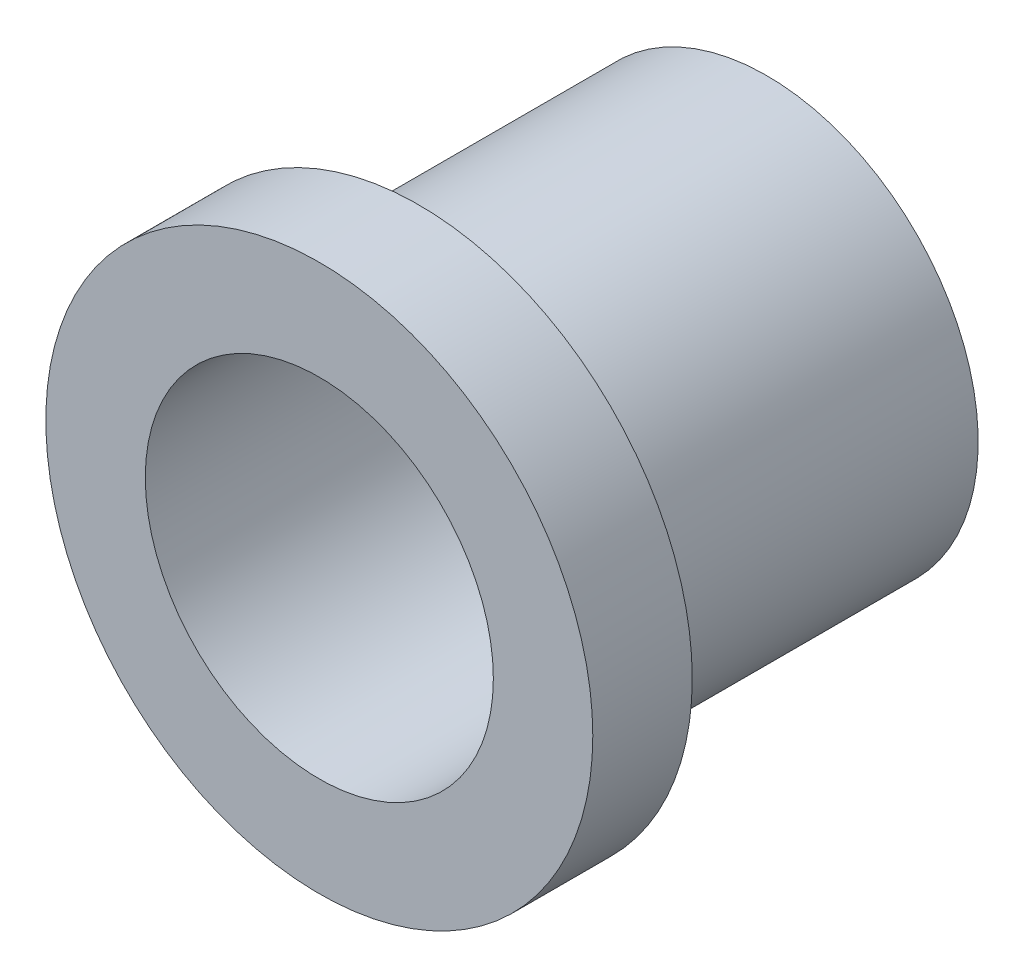
ISO-10303-21;
HEADER;
FILE_DESCRIPTION(('STEP AP214'),'2;1');
FILE_NAME('part.step','',(''),(''),'','','');
FILE_SCHEMA(('AUTOMOTIVE_DESIGN { 1 0 10303 214 1 1 1 1 }'));
ENDSEC;
DATA;
#1=APPLICATION_CONTEXT('core data for automotive mechanical design processes');
#2=APPLICATION_PROTOCOL_DEFINITION('international standard','automotive_design',2000,#1);
#3=PRODUCT_CONTEXT('',#1,'mechanical');
#4=PRODUCT('Part','Part','',(#3));
#5=PRODUCT_RELATED_PRODUCT_CATEGORY('part','',(#4));
#6=PRODUCT_DEFINITION_FORMATION('','',#4);
#7=PRODUCT_DEFINITION_CONTEXT('part definition',#1,'design');
#8=PRODUCT_DEFINITION('design','',#6,#7);
#9=PRODUCT_DEFINITION_SHAPE('','',#8);
#10=(LENGTH_UNIT() NAMED_UNIT(*) SI_UNIT(.MILLI.,.METRE.));
#11=(NAMED_UNIT(*) PLANE_ANGLE_UNIT() SI_UNIT($,.RADIAN.));
#12=(NAMED_UNIT(*) SI_UNIT($,.STERADIAN.) SOLID_ANGLE_UNIT());
#13=UNCERTAINTY_MEASURE_WITH_UNIT(LENGTH_MEASURE(1.E-05),#10,'distance_accuracy_value','');
#14=(GEOMETRIC_REPRESENTATION_CONTEXT(3) GLOBAL_UNCERTAINTY_ASSIGNED_CONTEXT((#13)) GLOBAL_UNIT_ASSIGNED_CONTEXT((#10,
#11,#12)) REPRESENTATION_CONTEXT('',''));
#15=CARTESIAN_POINT('',(0.,0.,0.));
#16=DIRECTION('',(0.,0.,1.));
#17=DIRECTION('',(1.,0.,0.));
#18=AXIS2_PLACEMENT_3D('',#15,#16,#17);
#19=CARTESIAN_POINT('',(0.,0.,-2.));
#20=DIRECTION('',(0.,0.,1.));
#21=DIRECTION('',(1.,0.,0.));
#22=AXIS2_PLACEMENT_3D('',#19,#20,#21);
#23=CYLINDRICAL_SURFACE('',#22,5.50000000000001);
#24=CARTESIAN_POINT('',(0.,0.,-2.));
#25=DIRECTION('',(0.,0.,1.));
#26=DIRECTION('',(1.,0.,0.));
#27=AXIS2_PLACEMENT_3D('',#24,#25,#26);
#28=CIRCLE('',#27,5.50000000000001);
#29=CARTESIAN_POINT('',(5.50000000000001,0.,-2.));
#30=VERTEX_POINT('',#29);
#31=EDGE_CURVE('E44',#30,#30,#28,.T.);
#32=ORIENTED_EDGE('',*,*,#31,.T.);
#33=EDGE_LOOP('',(#32));
#34=FACE_BOUND('',#33,.T.);
#35=CARTESIAN_POINT('',(0.,0.,0.));
#36=DIRECTION('',(0.,0.,1.));
#37=DIRECTION('',(1.,0.,0.));
#38=AXIS2_PLACEMENT_3D('',#35,#36,#37);
#39=CIRCLE('',#38,5.50000000000001);
#40=CARTESIAN_POINT('',(5.50000000000001,0.,0.));
#41=VERTEX_POINT('',#40);
#42=EDGE_CURVE('E40',#41,#41,#39,.T.);
#43=ORIENTED_EDGE('',*,*,#42,.F.);
#44=EDGE_LOOP('',(#43));
#45=FACE_BOUND('',#44,.T.);
#46=ADVANCED_FACE('F37',(#34,#45),#23,.T.);
#47=CARTESIAN_POINT('',(0.,0.,-2.));
#48=DIRECTION('',(0.,0.,1.));
#49=DIRECTION('',(1.,0.,0.));
#50=AXIS2_PLACEMENT_3D('',#47,#48,#49);
#51=PLANE('',#50);
#52=CARTESIAN_POINT('',(0.,0.,-2.));
#53=DIRECTION('',(0.,0.,-1.));
#54=DIRECTION('',(-1.,0.,0.));
#55=AXIS2_PLACEMENT_3D('',#52,#53,#54);
#56=CIRCLE('',#55,4.25);
#57=CARTESIAN_POINT('',(-4.25,0.,-2.));
#58=VERTEX_POINT('',#57);
#59=EDGE_CURVE('E10',#58,#58,#56,.T.);
#60=ORIENTED_EDGE('',*,*,#59,.F.);
#61=EDGE_LOOP('',(#60));
#62=FACE_BOUND('',#61,.T.);
#63=ORIENTED_EDGE('',*,*,#31,.F.);
#64=EDGE_LOOP('',(#63));
#65=FACE_BOUND('',#64,.T.);
#66=ADVANCED_FACE('F73',(#62,#65),#51,.F.);
#67=CARTESIAN_POINT('',(0.,0.,0.));
#68=DIRECTION('',(0.,0.,1.));
#69=DIRECTION('',(1.,0.,0.));
#70=AXIS2_PLACEMENT_3D('',#67,#68,#69);
#71=PLANE('',#70);
#72=CARTESIAN_POINT('',(0.,0.,0.));
#73=DIRECTION('',(0.,0.,1.));
#74=DIRECTION('',(1.,0.,0.));
#75=AXIS2_PLACEMENT_3D('',#72,#73,#74);
#76=CIRCLE('',#75,3.5);
#77=CARTESIAN_POINT('',(3.5,0.,0.));
#78=VERTEX_POINT('',#77);
#79=EDGE_CURVE('E54',#78,#78,#76,.T.);
#80=ORIENTED_EDGE('',*,*,#79,.F.);
#81=EDGE_LOOP('',(#80));
#82=FACE_BOUND('',#81,.T.);
#83=ORIENTED_EDGE('',*,*,#42,.T.);
#84=EDGE_LOOP('',(#83));
#85=FACE_BOUND('',#84,.T.);
#86=ADVANCED_FACE('F69',(#82,#85),#71,.T.);
#87=CARTESIAN_POINT('',(0.,0.,-9.));
#88=DIRECTION('',(0.,0.,1.));
#89=DIRECTION('',(1.,0.,0.));
#90=AXIS2_PLACEMENT_3D('',#87,#88,#89);
#91=CYLINDRICAL_SURFACE('',#90,4.25);
#92=CARTESIAN_POINT('',(0.,0.,-9.));
#93=DIRECTION('',(0.,0.,-1.));
#94=DIRECTION('',(-1.,0.,0.));
#95=AXIS2_PLACEMENT_3D('',#92,#93,#94);
#96=CIRCLE('',#95,4.25);
#97=CARTESIAN_POINT('',(-4.25,0.,-9.));
#98=VERTEX_POINT('',#97);
#99=EDGE_CURVE('E50',#98,#98,#96,.T.);
#100=ORIENTED_EDGE('',*,*,#99,.F.);
#101=EDGE_LOOP('',(#100));
#102=FACE_BOUND('',#101,.T.);
#103=ORIENTED_EDGE('',*,*,#59,.T.);
#104=EDGE_LOOP('',(#103));
#105=FACE_BOUND('',#104,.T.);
#106=ADVANCED_FACE('F72',(#102,#105),#91,.T.);
#107=CARTESIAN_POINT('',(0.,0.,-9.));
#108=DIRECTION('',(0.,0.,-1.));
#109=DIRECTION('',(-1.,0.,0.));
#110=AXIS2_PLACEMENT_3D('',#107,#108,#109);
#111=PLANE('',#110);
#112=ORIENTED_EDGE('',*,*,#99,.T.);
#113=EDGE_LOOP('',(#112));
#114=FACE_BOUND('',#113,.T.);
#115=ADVANCED_FACE('F65',(#114),#111,.T.);
#116=CARTESIAN_POINT('',(0.,0.,-8.));
#117=DIRECTION('',(0.,0.,1.));
#118=DIRECTION('',(1.,0.,0.));
#119=AXIS2_PLACEMENT_3D('',#116,#117,#118);
#120=CYLINDRICAL_SURFACE('',#119,3.5);
#121=CARTESIAN_POINT('',(0.,0.,-8.));
#122=DIRECTION('',(0.,0.,1.));
#123=DIRECTION('',(1.,0.,0.));
#124=AXIS2_PLACEMENT_3D('',#121,#122,#123);
#125=CIRCLE('',#124,3.5);
#126=CARTESIAN_POINT('',(3.5,0.,-8.));
#127=VERTEX_POINT('',#126);
#128=EDGE_CURVE('E53',#127,#127,#125,.T.);
#129=ORIENTED_EDGE('',*,*,#128,.F.);
#130=EDGE_LOOP('',(#129));
#131=FACE_BOUND('',#130,.T.);
#132=ORIENTED_EDGE('',*,*,#79,.T.);
#133=EDGE_LOOP('',(#132));
#134=FACE_BOUND('',#133,.T.);
#135=ADVANCED_FACE('F62',(#131,#134),#120,.F.);
#136=CARTESIAN_POINT('',(0.,0.,-8.));
#137=DIRECTION('',(0.,0.,1.));
#138=DIRECTION('',(1.,0.,0.));
#139=AXIS2_PLACEMENT_3D('',#136,#137,#138);
#140=PLANE('',#139);
#141=ORIENTED_EDGE('',*,*,#128,.T.);
#142=EDGE_LOOP('',(#141));
#143=FACE_BOUND('',#142,.T.);
#144=ADVANCED_FACE('F60',(#143),#140,.T.);
#145=CLOSED_SHELL('',(#46,#66,#86,#106,#115,#135,#144));
#146=MANIFOLD_SOLID_BREP('B2',#145);
#147=ADVANCED_BREP_SHAPE_REPRESENTATION('',(#18,#146),#14);
#148=SHAPE_DEFINITION_REPRESENTATION(#9,#147);
ENDSEC;
END-ISO-10303-21;
